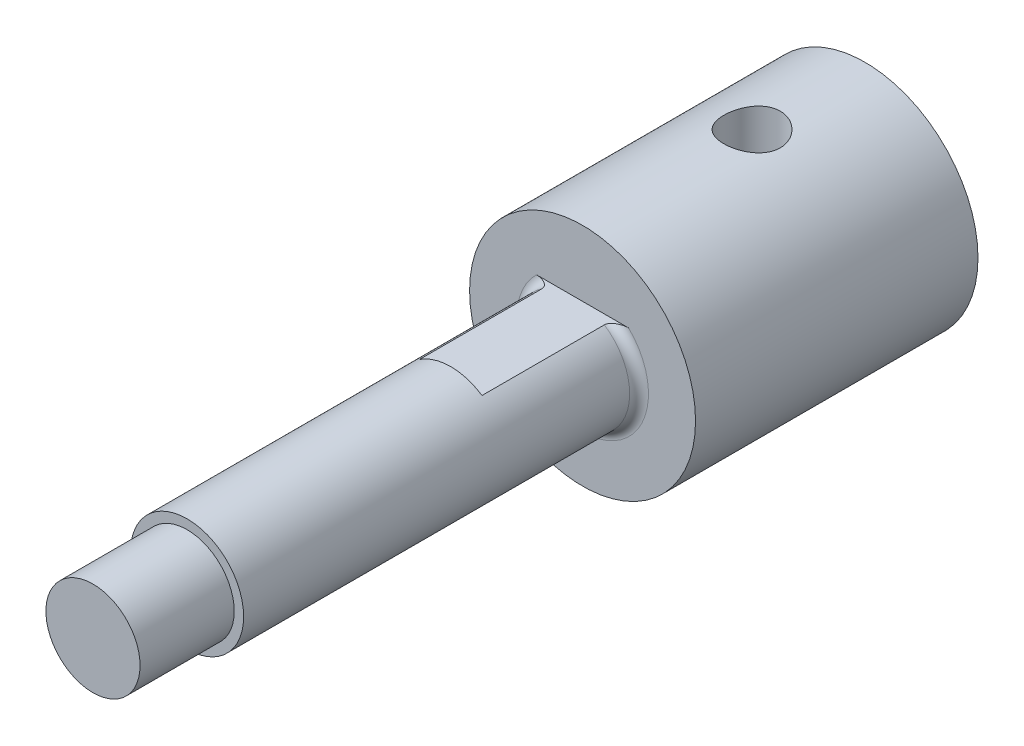
ISO-10303-21;
HEADER;
FILE_DESCRIPTION(('STEP AP214'),'2;1');
FILE_NAME('part.step','',(''),(''),'','','');
FILE_SCHEMA(('AUTOMOTIVE_DESIGN { 1 0 10303 214 1 1 1 1 }'));
ENDSEC;
DATA;
#1=APPLICATION_CONTEXT('core data for automotive mechanical design processes');
#2=APPLICATION_PROTOCOL_DEFINITION('international standard','automotive_design',2000,#1);
#3=PRODUCT_CONTEXT('',#1,'mechanical');
#4=PRODUCT('Part','Part','',(#3));
#5=PRODUCT_RELATED_PRODUCT_CATEGORY('part','',(#4));
#6=PRODUCT_DEFINITION_FORMATION('','',#4);
#7=PRODUCT_DEFINITION_CONTEXT('part definition',#1,'design');
#8=PRODUCT_DEFINITION('design','',#6,#7);
#9=PRODUCT_DEFINITION_SHAPE('','',#8);
#10=(LENGTH_UNIT() NAMED_UNIT(*) SI_UNIT(.MILLI.,.METRE.));
#11=(NAMED_UNIT(*) PLANE_ANGLE_UNIT() SI_UNIT($,.RADIAN.));
#12=(NAMED_UNIT(*) SI_UNIT($,.STERADIAN.) SOLID_ANGLE_UNIT());
#13=UNCERTAINTY_MEASURE_WITH_UNIT(LENGTH_MEASURE(1.E-05),#10,'distance_accuracy_value','');
#14=(GEOMETRIC_REPRESENTATION_CONTEXT(3) GLOBAL_UNCERTAINTY_ASSIGNED_CONTEXT((#13)) GLOBAL_UNIT_ASSIGNED_CONTEXT((#10,
#11,#12)) REPRESENTATION_CONTEXT('',''));
#15=CARTESIAN_POINT('',(0.,0.,0.));
#16=DIRECTION('',(0.,0.,1.));
#17=DIRECTION('',(1.,0.,0.));
#18=AXIS2_PLACEMENT_3D('',#15,#16,#17);
#19=CARTESIAN_POINT('',(6.91799850887597E-07,-0.0286323015875726,12.7411492059763));
#20=DIRECTION('',(0.,0.,-1.));
#21=DIRECTION('',(-1.,0.,0.));
#22=AXIS2_PLACEMENT_3D('',#19,#20,#21);
#23=CYLINDRICAL_SURFACE('',#22,3.);
#24=CARTESIAN_POINT('',(6.91799850887597E-07,-0.0286323015875726,7.24114920597634));
#25=DIRECTION('',(0.,0.,1.));
#26=DIRECTION('',(1.,0.,0.));
#27=AXIS2_PLACEMENT_3D('',#24,#25,#26);
#28=CIRCLE('',#27,3.);
#29=CARTESIAN_POINT('',(3.00000069179985,-0.0286323015875726,7.24114920597634));
#30=VERTEX_POINT('',#29);
#31=EDGE_CURVE('E138',#30,#30,#28,.T.);
#32=ORIENTED_EDGE('',*,*,#31,.T.);
#33=EDGE_LOOP('',(#32));
#34=FACE_BOUND('',#33,.T.);
#35=CARTESIAN_POINT('',(6.91799850887597E-07,2.97136769841243,9.49114920597634));
#36=CARTESIAN_POINT('',(-0.0414373525350146,2.97136699775249,9.49115036884542));
#37=CARTESIAN_POINT('',(-0.0828883871155306,2.97050058907157,9.49459498136323));
#38=CARTESIAN_POINT('',(-0.164602470085415,2.96712826756189,9.50826178162984));
#39=CARTESIAN_POINT('',(-0.204864831635518,2.96462142551227,9.51848781074526));
#40=CARTESIAN_POINT('',(-0.283009744291438,2.95824583007263,9.54536883270738));
#41=CARTESIAN_POINT('',(-0.320895089915151,2.95437871262286,9.56201610533398));
#42=CARTESIAN_POINT('',(-0.393335374152363,2.94569441745039,9.60123990099875));
#43=CARTESIAN_POINT('',(-0.427890200374529,2.94087720768268,9.62381662403581));
#44=CARTESIAN_POINT('',(-0.493400271850609,2.93070476637143,9.67474960080344));
#45=CARTESIAN_POINT('',(-0.524277153230685,2.92534123415509,9.70320499345593));
#46=CARTESIAN_POINT('',(-0.580873771801801,2.91473579900008,9.7648753084308));
#47=CARTESIAN_POINT('',(-0.606592926674717,2.90949390985417,9.79809076744958));
#48=CARTESIAN_POINT('',(-0.652512579599665,2.89964157691098,9.86894681934506));
#49=CARTESIAN_POINT('',(-0.672625416162828,2.89504167076545,9.90664582138154));
#50=CARTESIAN_POINT('',(-0.706197762475413,2.88711517247354,9.98502341180552));
#51=CARTESIAN_POINT('',(-0.719658335919816,2.88378837677637,10.0257015226392));
#52=CARTESIAN_POINT('',(-0.739276726602294,2.87887008200018,10.1080209550776));
#53=CARTESIAN_POINT('',(-0.745575442366819,2.87724515378956,10.1496266540012));
#54=CARTESIAN_POINT('',(-0.751130195734075,2.87581451110113,10.2333334904833));
#55=CARTESIAN_POINT('',(-0.750387379109138,2.87600850065565,10.2754345463256));
#56=CARTESIAN_POINT('',(-0.741992570519789,2.87816372589552,10.3578571098486));
#57=CARTESIAN_POINT('',(-0.734508478295409,2.88008201342182,10.3981970167089));
#58=CARTESIAN_POINT('',(-0.713111401651702,2.88540124679485,10.477029731432));
#59=CARTESIAN_POINT('',(-0.699197959234861,2.88880229826591,10.5155224074908));
#60=CARTESIAN_POINT('',(-0.665194047168726,2.89674326793336,10.5900182141024));
#61=CARTESIAN_POINT('',(-0.645042641816604,2.90129433575953,10.6259922918711));
#62=CARTESIAN_POINT('',(-0.599177446207626,2.91101625264436,10.6941085608548));
#63=CARTESIAN_POINT('',(-0.573462682604569,2.9161872100861,10.72625008001));
#64=CARTESIAN_POINT('',(-0.516331020540758,2.92674710111133,10.7867510138235));
#65=CARTESIAN_POINT('',(-0.484772437283079,2.93213804580229,10.814976451007));
#66=CARTESIAN_POINT('',(-0.417305266951999,2.94239752630636,10.8657598272083));
#67=CARTESIAN_POINT('',(-0.381396547054121,2.94726604615951,10.8883175931081));
#68=CARTESIAN_POINT('',(-0.306057252540845,2.95595635888334,10.9271744990885));
#69=CARTESIAN_POINT('',(-0.266615004804461,2.95977449905105,10.9434518761036));
#70=CARTESIAN_POINT('',(-0.18543731227159,2.96590728336952,10.9691078588311));
#71=CARTESIAN_POINT('',(-0.143702307775391,2.96822221510883,10.9784877841854));
#72=CARTESIAN_POINT('',(-0.0602692933951623,2.9710451947693,10.9898779887558));
#73=CARTESIAN_POINT('',(-0.0185976681942537,2.97159796595382,10.992070719014));
#74=CARTESIAN_POINT('',(0.0645171292006052,2.97096172248468,10.9895247049486));
#75=CARTESIAN_POINT('',(0.105960321622149,2.96977286462166,10.9847865845768));
#76=CARTESIAN_POINT('',(0.186807826188097,2.96581560404921,10.9686637517806));
#77=CARTESIAN_POINT('',(0.226233251284228,2.96307086934148,10.9573785742378));
#78=CARTESIAN_POINT('',(0.302629338026107,2.9563112315831,10.9285956639621));
#79=CARTESIAN_POINT('',(0.339599751316168,2.95229620026189,10.9110973038198));
#80=CARTESIAN_POINT('',(0.410762259014775,2.94333423804398,10.870031141539));
#81=CARTESIAN_POINT('',(0.444893412717767,2.93837203524709,10.846361149778));
#82=CARTESIAN_POINT('',(0.508763998621474,2.92809024434952,10.7937542515779));
#83=CARTESIAN_POINT('',(0.538502671286355,2.92277059467095,10.7648164361679));
#84=CARTESIAN_POINT('',(0.593495975836216,2.91221248321628,10.7016482255541));
#85=CARTESIAN_POINT('',(0.618622625610866,2.90697921934883,10.6673053544751));
#86=CARTESIAN_POINT('',(0.662756071306199,2.89733209029862,10.5947828887435));
#87=CARTESIAN_POINT('',(0.681763138878819,2.89291818874756,10.5566034644965));
#88=CARTESIAN_POINT('',(0.712976402104497,2.88545817208575,10.4776963447698));
#89=CARTESIAN_POINT('',(0.725222890126884,2.88240397487196,10.4369853918043));
#90=CARTESIAN_POINT('',(0.74267352177674,2.87800141886335,10.3539943870318));
#91=CARTESIAN_POINT('',(0.74787920553918,2.87665268701211,10.3117146804601));
#92=CARTESIAN_POINT('',(0.751019986966848,2.87584220443221,10.2280886940487));
#93=CARTESIAN_POINT('',(0.74915964068991,2.87632736205375,10.186750488414));
#94=CARTESIAN_POINT('',(0.738689330956284,2.87900724345164,10.1049972616423));
#95=CARTESIAN_POINT('',(0.730079503143235,2.88120193287171,10.0645822219695));
#96=CARTESIAN_POINT('',(0.706466351521248,2.88702400182604,9.98604497644363));
#97=CARTESIAN_POINT('',(0.691501394140039,2.89064277459397,9.94791055335624));
#98=CARTESIAN_POINT('',(0.655633148602386,2.89890647703657,9.87466651461949));
#99=CARTESIAN_POINT('',(0.634729036816945,2.90355154901629,9.83955731938288));
#100=CARTESIAN_POINT('',(0.586934566118419,2.91349586972999,9.77237189147533));
#101=CARTESIAN_POINT('',(0.559902273255978,2.91880902257121,9.74039866926436));
#102=CARTESIAN_POINT('',(0.500895377394719,2.92940783464386,9.68137568357863));
#103=CARTESIAN_POINT('',(0.468919602430424,2.93469348704773,9.65432709091985));
#104=CARTESIAN_POINT('',(0.400234485151146,2.94475597665074,9.60544355169403));
#105=CARTESIAN_POINT('',(0.363449902958044,2.94952186524177,9.58371189914055));
#106=CARTESIAN_POINT('',(0.286633721555089,2.95789232328802,9.54677547450607));
#107=CARTESIAN_POINT('',(0.24660447351822,2.96149772441133,9.53156602565207));
#108=CARTESIAN_POINT('',(0.172205818421587,2.96660799624014,9.51036329081151));
#109=CARTESIAN_POINT('',(0.138190777253885,2.96838062367588,9.50317358444962));
#110=CARTESIAN_POINT('',(0.0694537275679925,2.97076072457217,9.49356623416537));
#111=CARTESIAN_POINT('',(0.034731772421159,2.9713682856669,9.49114823132369));
#112=CARTESIAN_POINT('',(6.91799850887597E-07,2.97136769841243,9.49114920597634));
#113=B_SPLINE_CURVE_WITH_KNOTS('',3,(#35,#36,#37,#38,#39,#40,#41,#42,#43,#44,#45,#46,#47,#48,
#49,#50,#51,#52,#53,#54,#55,#56,#57,#58,#59,#60,#61,#62,#63,#64,#65,#66,#67,#68,#69,#70,#71,#72,
#73,#74,#75,#76,#77,#78,#79,#80,#81,#82,#83,#84,#85,#86,#87,#88,#89,#90,#91,#92,#93,#94,#95,#96,
#97,#98,#99,#100,#101,#102,#103,#104,#105,#106,#107,#108,#109,#110,#111,#112),.UNSPECIFIED.,.T.,
.F.,(4,2,2,2,2,2,2,2,2,2,2,2,2,2,2,2,2,2,2,2,2,2,2,2,2,2,2,2,2,2,2,2,2,2,2,2,2,2,4),(0.,
0.124186856235945,0.24844411888195,0.372552451143053,0.496664970084664,0.623072177185695,
0.749493647900309,0.877793237729035,1.00607230584684,1.13178147549715,1.25747019056349,
1.38011248503509,1.50276351733019,1.6266526393694,1.75056345418081,1.8780075048451,
2.00545544779124,2.13334114504557,2.26120236844321,2.38579154474638,2.51036950556371,
2.63310137257019,2.75584563661145,2.88076793782676,3.0057118150401,3.13372254602238,
3.26172759374754,3.38896127307018,3.51616711626204,3.63971890199306,3.76326820478017,
3.88608200279724,4.00891284068451,4.13494788204955,4.26101284885209,4.38936092749794,
4.51761681910675,4.62171121471074,4.7257977802152),.UNSPECIFIED.);
#114=CARTESIAN_POINT('',(6.91799850887597E-07,2.97136769841243,9.49114920597634));
#115=VERTEX_POINT('',#114);
#116=EDGE_CURVE('E107',#115,#115,#113,.T.);
#117=ORIENTED_EDGE('',*,*,#116,.F.);
#118=EDGE_LOOP('',(#117));
#119=FACE_BOUND('',#118,.T.);
#120=CARTESIAN_POINT('',(6.91799850887597E-07,-0.0286323015875726,14.7411492059763));
#121=DIRECTION('',(0.,0.,1.));
#122=DIRECTION('',(1.,0.,0.));
#123=AXIS2_PLACEMENT_3D('',#120,#121,#122);
#124=CIRCLE('',#123,3.);
#125=CARTESIAN_POINT('',(3.00000069179985,-0.0286323015875726,14.7411492059763));
#126=VERTEX_POINT('',#125);
#127=EDGE_CURVE('E103',#126,#126,#124,.T.);
#128=ORIENTED_EDGE('',*,*,#127,.F.);
#129=EDGE_LOOP('',(#128));
#130=FACE_BOUND('',#129,.T.);
#131=ADVANCED_FACE('F37',(#34,#119,#130),#23,.T.);
#132=CARTESIAN_POINT('',(6.91799850887597E-07,-0.0286323015875726,12.7411492059763));
#133=DIRECTION('',(0.,0.,-1.));
#134=DIRECTION('',(-1.,0.,0.));
#135=AXIS2_PLACEMENT_3D('',#132,#133,#134);
#136=CYLINDRICAL_SURFACE('',#135,1.5);
#137=CARTESIAN_POINT('',(6.91799850887597E-07,-0.0286323015875726,7.24114920597634));
#138=DIRECTION('',(0.,0.,1.));
#139=DIRECTION('',(1.,0.,0.));
#140=AXIS2_PLACEMENT_3D('',#137,#138,#139);
#141=CIRCLE('',#140,1.5);
#142=CARTESIAN_POINT('',(1.50000069179985,-0.0286323015875726,7.24114920597634));
#143=VERTEX_POINT('',#142);
#144=EDGE_CURVE('E114',#143,#143,#141,.T.);
#145=ORIENTED_EDGE('',*,*,#144,.F.);
#146=EDGE_LOOP('',(#145));
#147=FACE_BOUND('',#146,.T.);
#148=CARTESIAN_POINT('',(6.91799850887597E-07,-0.0286323015875726,12.7411492059763));
#149=DIRECTION('',(0.,0.,1.));
#150=DIRECTION('',(1.,0.,0.));
#151=AXIS2_PLACEMENT_3D('',#148,#149,#150);
#152=CIRCLE('',#151,1.5);
#153=CARTESIAN_POINT('',(1.50000069179985,-0.0286323015875726,12.7411492059763));
#154=VERTEX_POINT('',#153);
#155=EDGE_CURVE('E106',#154,#154,#152,.T.);
#156=ORIENTED_EDGE('',*,*,#155,.T.);
#157=EDGE_LOOP('',(#156));
#158=FACE_BOUND('',#157,.T.);
#159=CARTESIAN_POINT('',(6.91799850887597E-07,1.47136769841243,9.49114920597634));
#160=CARTESIAN_POINT('',(-0.0394282804148889,1.47136554894356,9.49115168271596));
#161=CARTESIAN_POINT('',(-0.0789042579736734,1.46979638105881,9.49427676081759));
#162=CARTESIAN_POINT('',(-0.156689484651468,1.4636738686929,9.50663886623203));
#163=CARTESIAN_POINT('',(-0.194996373235277,1.4591148571298,9.51588750072458));
#164=CARTESIAN_POINT('',(-0.26919946686058,1.44748979393726,9.54004456243893));
#165=CARTESIAN_POINT('',(-0.305104410404534,1.44043349224383,9.55493099416235));
#166=CARTESIAN_POINT('',(-0.373853770805073,1.42446102228077,9.58982717200004));
#167=CARTESIAN_POINT('',(-0.406698428692686,1.4155450006639,9.60983651416298));
#168=CARTESIAN_POINT('',(-0.470630171521588,1.39603963534785,9.65578714309031));
#169=CARTESIAN_POINT('',(-0.501490716541733,1.38538169186895,9.68201406540607));
#170=CARTESIAN_POINT('',(-0.558583891850382,1.36381747526301,9.73904031541161));
#171=CARTESIAN_POINT('',(-0.584812995530224,1.35291101998019,9.76984309480567));
#172=CARTESIAN_POINT('',(-0.633938308537858,1.33110983239253,9.83801171811888));
#173=CARTESIAN_POINT('',(-0.656418309863877,1.32028160068842,9.87570127973577));
#174=CARTESIAN_POINT('',(-0.694625478368171,1.30101253920483,9.954924707966));
#175=CARTESIAN_POINT('',(-0.710357469424899,1.29257000546485,9.9964558025184));
#176=CARTESIAN_POINT('',(-0.733598639841591,1.27980170119599,10.0796480350428));
#177=CARTESIAN_POINT('',(-0.74154370101048,1.27525973529028,10.1211525450269));
#178=CARTESIAN_POINT('',(-0.750319553181784,1.27023187302639,10.2051333343109));
#179=CARTESIAN_POINT('',(-0.751157374479955,1.26974196848709,10.2476086116297));
#180=CARTESIAN_POINT('',(-0.74601477357937,1.27269967534179,10.3268637242129));
#181=CARTESIAN_POINT('',(-0.740837727852765,1.27568342587753,10.3637172293936));
#182=CARTESIAN_POINT('',(-0.725204194992849,1.2844394139163,10.4359406380061));
#183=CARTESIAN_POINT('',(-0.714746026123389,1.29021253965075,10.4713100649553));
#184=CARTESIAN_POINT('',(-0.688656643489652,1.30402377150799,10.5405710554006));
#185=CARTESIAN_POINT('',(-0.672910608537145,1.31211150339242,10.5744090050657));
#186=CARTESIAN_POINT('',(-0.636780573951151,1.32964323052296,10.6391249254188));
#187=CARTESIAN_POINT('',(-0.6163944910595,1.33908783426386,10.6700015576764));
#188=CARTESIAN_POINT('',(-0.568548849384741,1.35971638268707,10.7320401455338));
#189=CARTESIAN_POINT('',(-0.54052015197711,1.37096902518802,10.7627418611585));
#190=CARTESIAN_POINT('',(-0.479665992256179,1.39297487316548,10.8192007699195));
#191=CARTESIAN_POINT('',(-0.446838250630863,1.40372783810343,10.8449556000018));
#192=CARTESIAN_POINT('',(-0.375386687574035,1.42413260303466,10.8919134517486));
#193=CARTESIAN_POINT('',(-0.336564501899705,1.43371007962748,10.9128495603106));
#194=CARTESIAN_POINT('',(-0.255348969816746,1.45005180682174,10.9477219777586));
#195=CARTESIAN_POINT('',(-0.212958490399106,1.45681829048907,10.9616638447377));
#196=CARTESIAN_POINT('',(-0.129574176945675,1.4663002014732,10.9810057587638));
#197=CARTESIAN_POINT('',(-0.0887554561113922,1.46930473567227,10.9870176327864));
#198=CARTESIAN_POINT('',(-0.00658400816216417,1.47191529935569,10.9922477543272));
#199=CARTESIAN_POINT('',(0.0347684567022771,1.47152293882227,10.9914692202059));
#200=CARTESIAN_POINT('',(0.113425420789346,1.46755164031323,10.9834941896623));
#201=CARTESIAN_POINT('',(0.150795247837317,1.46422204107385,10.9767998064288));
#202=CARTESIAN_POINT('',(0.223805861026288,1.45503398327357,10.957970652055));
#203=CARTESIAN_POINT('',(0.259446456068098,1.44917524591992,10.9458352811363));
#204=CARTESIAN_POINT('',(0.3291671481371,1.43524958401495,10.9161503561515));
#205=CARTESIAN_POINT('',(0.363173489554467,1.42712431168697,10.8984559183887));
#206=CARTESIAN_POINT('',(0.427846713074043,1.40944750579074,10.8583185542418));
#207=CARTESIAN_POINT('',(0.458512164131313,1.39989536515582,10.8358736050313));
#208=CARTESIAN_POINT('',(0.51882645876784,1.37917935844341,10.7843288869767));
#209=CARTESIAN_POINT('',(0.548079750168329,1.36794933477574,10.7547920546362));
#210=CARTESIAN_POINT('',(0.60139293263478,1.34583563544149,10.6912053425244));
#211=CARTESIAN_POINT('',(0.625449231067981,1.33495220377388,10.6571523668641));
#212=CARTESIAN_POINT('',(0.668781627673122,1.31425164010794,10.5834164653261));
#213=CARTESIAN_POINT('',(0.687769813708828,1.30451167088847,10.5435407563199));
#214=CARTESIAN_POINT('',(0.718562811310202,1.28817324117337,10.460516655207));
#215=CARTESIAN_POINT('',(0.730376878715528,1.28157073521706,10.4173725611004));
#216=CARTESIAN_POINT('',(0.74539695738711,1.27307895597743,10.3334665388303));
#217=CARTESIAN_POINT('',(0.7493204391005,1.27079807436611,10.2928735159046));
#218=CARTESIAN_POINT('',(0.750517557585441,1.27010785825874,10.2115639055983));
#219=CARTESIAN_POINT('',(0.74779407676815,1.27169684561907,10.1708473794218));
#220=CARTESIAN_POINT('',(0.736445285994048,1.27815166378761,10.0945365798273));
#221=CARTESIAN_POINT('',(0.728406927556951,1.28269090703038,10.058823853368));
#222=CARTESIAN_POINT('',(0.707382210468335,1.29415031982181,9.98929311640781));
#223=CARTESIAN_POINT('',(0.694394260169709,1.30107125518499,9.95547571940736));
#224=CARTESIAN_POINT('',(0.662862500775363,1.31708167614639,9.88818056773638));
#225=CARTESIAN_POINT('',(0.644004045162194,1.32628561638386,9.85487827960406));
#226=CARTESIAN_POINT('',(0.601613920527326,1.34563268567185,9.7916933038409));
#227=CARTESIAN_POINT('',(0.578079820228837,1.35577630187134,9.76181240808747));
#228=CARTESIAN_POINT('',(0.523653186798332,1.37733512210727,9.70254271920813));
#229=CARTESIAN_POINT('',(0.49221400905748,1.38875507324844,9.6736548792049));
#230=CARTESIAN_POINT('',(0.424616796465061,1.41045084032558,9.62145196840861));
#231=CARTESIAN_POINT('',(0.38845623424244,1.42072603797273,9.59813990140662));
#232=CARTESIAN_POINT('',(0.311949389414811,1.4391027703007,9.55772193390469));
#233=CARTESIAN_POINT('',(0.271575319750812,1.44718842263424,9.54066107891776));
#234=CARTESIAN_POINT('',(0.188057267770494,1.46012775863842,9.51379308003712));
#235=CARTESIAN_POINT('',(0.144921541517225,1.46499062370942,9.50396532085415));
#236=CARTESIAN_POINT('',(0.0844521516623888,1.4690836627349,9.49572614766945));
#237=CARTESIAN_POINT('',(0.067622101379475,1.46993793845644,9.49401222532862));
#238=CARTESIAN_POINT('',(0.0338644906552192,1.47108042574641,9.49172320683873));
#239=CARTESIAN_POINT('',(0.016936927535387,1.47136862169065,9.49114814212294));
#240=CARTESIAN_POINT('',(6.91799850887597E-07,1.47136769841243,9.49114920597634));
#241=B_SPLINE_CURVE_WITH_KNOTS('',3,(#159,#160,#161,#162,#163,#164,#165,#166,#167,#168,#169,
#170,#171,#172,#173,#174,#175,#176,#177,#178,#179,#180,#181,#182,#183,#184,#185,#186,#187,#188,
#189,#190,#191,#192,#193,#194,#195,#196,#197,#198,#199,#200,#201,#202,#203,#204,#205,#206,#207,
#208,#209,#210,#211,#212,#213,#214,#215,#216,#217,#218,#219,#220,#221,#222,#223,#224,#225,#226,
#227,#228,#229,#230,#231,#232,#233,#234,#235,#236,#237,#238,#239,#240),.UNSPECIFIED.,.T.,.F.,(4,
2,2,2,2,2,2,2,2,2,2,2,2,2,2,2,2,2,2,2,2,2,2,2,2,2,2,2,2,2,2,2,2,2,2,2,2,2,2,2,4),(0.,
0.118218193065219,0.236661112281898,0.354646616619224,0.472622820436176,0.597736319038567,
0.722944678240527,0.857862948230645,0.992684609237108,1.11943509105172,1.24606017996765,
1.3575428430699,1.46906102944259,1.58317680126365,1.69734390945166,1.82598706000409,
1.95469150949015,2.0893726666083,2.2239466268421,2.34737467853509,2.47074423383607,
2.58455179879591,2.69837191223199,2.81544642020924,2.93257088061254,3.06119707983314,
3.18991191461574,3.32486011619755,3.45963383955583,3.5814698062378,3.70325294895004,
3.81343447683137,3.92365146587758,4.04127342581711,4.15895670854218,4.29093932064374,
4.4229928753243,4.55598010247194,4.68858681468698,4.73936460103273,4.79014378886135),.UNSPECIFIED.);
#242=CARTESIAN_POINT('',(6.91799850887597E-07,1.47136769841243,9.49114920597634));
#243=VERTEX_POINT('',#242);
#244=EDGE_CURVE('E115',#243,#243,#241,.T.);
#245=ORIENTED_EDGE('',*,*,#244,.T.);
#246=EDGE_LOOP('',(#245));
#247=FACE_BOUND('',#246,.T.);
#248=ADVANCED_FACE('F128',(#147,#158,#247),#136,.F.);
#249=CARTESIAN_POINT('',(6.91799850887597E-07,-0.0286323015875726,7.24114920597634));
#250=DIRECTION('',(0.,0.,1.));
#251=DIRECTION('',(1.,0.,0.));
#252=AXIS2_PLACEMENT_3D('',#249,#250,#251);
#253=PLANE('',#252);
#254=ORIENTED_EDGE('',*,*,#31,.F.);
#255=EDGE_LOOP('',(#254));
#256=FACE_BOUND('',#255,.T.);
#257=ORIENTED_EDGE('',*,*,#144,.T.);
#258=EDGE_LOOP('',(#257));
#259=FACE_BOUND('',#258,.T.);
#260=ADVANCED_FACE('F125',(#256,#259),#253,.F.);
#261=CARTESIAN_POINT('',(6.91799850887597E-07,2.97136769841243,10.2411492059763));
#262=DIRECTION('',(0.,-1.,0.));
#263=DIRECTION('',(0.,0.,-1.));
#264=AXIS2_PLACEMENT_3D('',#261,#262,#263);
#265=CYLINDRICAL_SURFACE('',#264,0.75);
#266=ORIENTED_EDGE('',*,*,#244,.F.);
#267=EDGE_LOOP('',(#266));
#268=FACE_BOUND('',#267,.T.);
#269=ORIENTED_EDGE('',*,*,#116,.T.);
#270=EDGE_LOOP('',(#269));
#271=FACE_BOUND('',#270,.T.);
#272=ADVANCED_FACE('F119',(#268,#271),#265,.F.);
#273=CARTESIAN_POINT('',(6.91799850887597E-07,-0.0286323015875726,12.7411492059763));
#274=DIRECTION('',(0.,0.,1.));
#275=DIRECTION('',(1.,0.,0.));
#276=AXIS2_PLACEMENT_3D('',#273,#274,#275);
#277=PLANE('',#276);
#278=ORIENTED_EDGE('',*,*,#155,.F.);
#279=EDGE_LOOP('',(#278));
#280=FACE_BOUND('',#279,.T.);
#281=ADVANCED_FACE('F124',(#280),#277,.F.);
#282=CARTESIAN_POINT('',(6.91799850887597E-07,-0.0286323015875726,14.7411492059763));
#283=DIRECTION('',(0.,0.,1.));
#284=DIRECTION('',(1.,0.,0.));
#285=AXIS2_PLACEMENT_3D('',#282,#283,#284);
#286=PLANE('',#285);
#287=DIRECTION('',(-1.,0.,0.));
#288=VECTOR('',#287,1.);
#289=CARTESIAN_POINT('',(-0.829155505788999,1.22136769841243,14.7411492059763));
#290=LINE('',#289,#288);
#291=CARTESIAN_POINT('',(1.22474556319144,1.22136769841243,14.7411492059763));
#292=VERTEX_POINT('',#291);
#293=CARTESIAN_POINT('',(-1.22474417959174,1.22136769841243,14.7411492059763));
#294=VERTEX_POINT('',#293);
#295=EDGE_CURVE('E57',#292,#294,#290,.T.);
#296=ORIENTED_EDGE('',*,*,#295,.F.);
#297=CARTESIAN_POINT('',(6.91799850887597E-07,-0.0286323015875726,14.7411492059763));
#298=DIRECTION('',(0.,0.,1.));
#299=DIRECTION('',(1.,0.,0.));
#300=AXIS2_PLACEMENT_3D('',#297,#298,#299);
#301=CIRCLE('',#300,1.75);
#302=EDGE_CURVE('E141',#292,#294,#301,.F.);
#303=ORIENTED_EDGE('',*,*,#302,.T.);
#304=EDGE_LOOP('',(#296,#303));
#305=FACE_BOUND('',#304,.T.);
#306=ORIENTED_EDGE('',*,*,#127,.T.);
#307=EDGE_LOOP('',(#306));
#308=FACE_BOUND('',#307,.T.);
#309=ADVANCED_FACE('F154',(#305,#308),#286,.T.);
#310=CARTESIAN_POINT('',(6.91799850887597E-07,-0.0286323015875726,18.2411492059763));
#311=DIRECTION('',(0.,0.,-1.));
#312=DIRECTION('',(-1.,0.,0.));
#313=AXIS2_PLACEMENT_3D('',#310,#311,#312);
#314=CYLINDRICAL_SURFACE('',#313,1.5);
#315=DIRECTION('',(0.,0.,-1.));
#316=VECTOR('',#315,1.);
#317=CARTESIAN_POINT('',(-0.829155505788999,1.22136769841243,18.2411492059763));
#318=LINE('',#317,#316);
#319=CARTESIAN_POINT('',(-0.829155505789,1.22136769841243,18.2411492059763));
#320=VERTEX_POINT('',#319);
#321=CARTESIAN_POINT('',(-0.829155505788999,1.22136769841243,14.9911492059763));
#322=VERTEX_POINT('',#321);
#323=EDGE_CURVE('E72',#320,#322,#318,.T.);
#324=ORIENTED_EDGE('',*,*,#323,.T.);
#325=CARTESIAN_POINT('',(6.91799850887597E-07,-0.0286323015875726,14.9911492059763));
#326=DIRECTION('',(0.,0.,1.));
#327=DIRECTION('',(1.,0.,0.));
#328=AXIS2_PLACEMENT_3D('',#325,#326,#327);
#329=CIRCLE('',#328,1.5);
#330=CARTESIAN_POINT('',(0.829156889388701,1.22136769841243,14.9911492059763));
#331=VERTEX_POINT('',#330);
#332=EDGE_CURVE('E139',#322,#331,#329,.T.);
#333=ORIENTED_EDGE('',*,*,#332,.T.);
#334=DIRECTION('',(0.,0.,-1.));
#335=VECTOR('',#334,1.);
#336=CARTESIAN_POINT('',(0.829156889388701,1.22136769841243,18.2411492059763));
#337=LINE('',#336,#335);
#338=CARTESIAN_POINT('',(0.829156889388701,1.22136769841243,18.2411492059763));
#339=VERTEX_POINT('',#338);
#340=EDGE_CURVE('E83',#339,#331,#337,.T.);
#341=ORIENTED_EDGE('',*,*,#340,.F.);
#342=CARTESIAN_POINT('',(6.91799850887597E-07,-0.0286323015875726,18.2411492059763));
#343=DIRECTION('',(0.,0.,1.));
#344=DIRECTION('',(1.,0.,0.));
#345=AXIS2_PLACEMENT_3D('',#342,#343,#344);
#346=CIRCLE('',#345,1.5);
#347=EDGE_CURVE('E88',#339,#320,#346,.T.);
#348=ORIENTED_EDGE('',*,*,#347,.T.);
#349=EDGE_LOOP('',(#324,#333,#341,#348));
#350=FACE_BOUND('',#349,.T.);
#351=CARTESIAN_POINT('',(6.91799850887597E-07,-0.0286323015875726,25.2411492059763));
#352=DIRECTION('',(0.,0.,1.));
#353=DIRECTION('',(1.,0.,0.));
#354=AXIS2_PLACEMENT_3D('',#351,#352,#353);
#355=CIRCLE('',#354,1.5);
#356=CARTESIAN_POINT('',(1.50000069179985,-0.0286323015875726,25.2411492059763));
#357=VERTEX_POINT('',#356);
#358=EDGE_CURVE('E92',#357,#357,#355,.T.);
#359=ORIENTED_EDGE('',*,*,#358,.F.);
#360=EDGE_LOOP('',(#359));
#361=FACE_BOUND('',#360,.T.);
#362=ADVANCED_FACE('F90',(#350,#361),#314,.T.);
#363=CARTESIAN_POINT('',(-0.829155505788999,1.22136769841243,18.2411492059763));
#364=DIRECTION('',(0.,-1.,0.));
#365=DIRECTION('',(0.,0.,-1.));
#366=AXIS2_PLACEMENT_3D('',#363,#364,#365);
#367=PLANE('',#366);
#368=ORIENTED_EDGE('',*,*,#295,.T.);
#369=CARTESIAN_POINT('',(-1.22474417959174,1.22136769841243,14.7411492059763));
#370=CARTESIAN_POINT('',(-1.20969800614567,1.22136769841243,14.7411529900924));
#371=CARTESIAN_POINT('',(-1.19466537497488,1.22136769841243,14.7418140470758));
#372=CARTESIAN_POINT('',(-1.16470518370032,1.22136769841243,14.744401785415));
#373=CARTESIAN_POINT('',(-1.14977764988422,1.22136769841243,14.7463287727891));
#374=CARTESIAN_POINT('',(-1.10501735255556,1.22136769841243,14.7539797244207));
#375=CARTESIAN_POINT('',(-1.07547700016086,1.22136769841243,14.7615720589956));
#376=CARTESIAN_POINT('',(-1.02470317791437,1.22136769841243,14.7793253081169));
#377=CARTESIAN_POINT('',(-1.00311645676078,1.22136769841243,14.7884999849544));
#378=CARTESIAN_POINT('',(-0.96156421430418,1.22136769841243,14.8099288276974));
#379=CARTESIAN_POINT('',(-0.941592706282843,1.22136769841243,14.8221708605897));
#380=CARTESIAN_POINT('',(-0.912535945441705,1.22136769841243,14.8440278011034));
#381=CARTESIAN_POINT('',(-0.902531818900248,1.22136769841243,14.852422996358));
#382=CARTESIAN_POINT('',(-0.883696585033778,1.22136769841243,14.8704646992181));
#383=CARTESIAN_POINT('',(-0.874864924431815,1.22136769841243,14.8801106123419));
#384=CARTESIAN_POINT('',(-0.86073598673253,1.22136769841243,14.8984047278224));
#385=CARTESIAN_POINT('',(-0.855091534471518,1.22136769841243,14.9067820589118));
#386=CARTESIAN_POINT('',(-0.845208697227097,1.22136769841243,14.9243054354309));
#387=CARTESIAN_POINT('',(-0.840964546210546,1.22136769841243,14.933448129104));
#388=CARTESIAN_POINT('',(-0.834907385960766,1.22136769841243,14.9506092565965));
#389=CARTESIAN_POINT('',(-0.832788047237587,1.22136769841243,14.9585178901861));
#390=CARTESIAN_POINT('',(-0.829894955642934,1.22136769841243,14.9746571560293));
#391=CARTESIAN_POINT('',(-0.829135141510564,1.22136769841243,14.9828902490759));
#392=CARTESIAN_POINT('',(-0.829155505788973,1.22136769841243,14.9911492059763));
#393=B_SPLINE_CURVE_WITH_KNOTS('',3,(#369,#370,#371,#372,#373,#374,#375,#376,#377,#378,#379,
#380,#381,#382,#383,#384,#385,#386,#387,#388,#389,#390,#391,#392),.UNSPECIFIED.,.F.,.F.,(4,2,2,
2,2,2,2,2,2,2,2,4),(0.,0.0450996365959334,0.0902101793152455,0.181232105893071,
0.251411768604862,0.321318099033901,0.360417721778356,0.399498827649005,0.429704971250216,
0.45978513559716,0.484236039427718,0.508936223945825),.UNSPECIFIED.);
#394=EDGE_CURVE('E11',#294,#322,#393,.T.);
#395=ORIENTED_EDGE('',*,*,#394,.T.);
#396=ORIENTED_EDGE('',*,*,#323,.F.);
#397=DIRECTION('',(-1.,0.,0.));
#398=VECTOR('',#397,1.);
#399=CARTESIAN_POINT('',(-0.829155505788999,1.22136769841243,18.2411492059763));
#400=LINE('',#399,#398);
#401=EDGE_CURVE('E76',#339,#320,#400,.T.);
#402=ORIENTED_EDGE('',*,*,#401,.F.);
#403=ORIENTED_EDGE('',*,*,#340,.T.);
#404=CARTESIAN_POINT('',(0.829156889388701,1.22136769841243,14.9911492059763));
#405=CARTESIAN_POINT('',(0.829135486649642,1.22136769841243,14.9827598600102));
#406=CARTESIAN_POINT('',(0.829919842983571,1.22136769841243,14.9743984200507));
#407=CARTESIAN_POINT('',(0.832901520246231,1.22136769841243,14.958021812278));
#408=CARTESIAN_POINT('',(0.835083290180815,1.22136769841243,14.9500038570562));
#409=CARTESIAN_POINT('',(0.841363882522285,1.22136769841243,14.9324723634728));
#410=CARTESIAN_POINT('',(0.845804669286281,1.22136769841243,14.9230832162712));
#411=CARTESIAN_POINT('',(0.856144797070143,1.22136769841243,14.9051153706713));
#412=CARTESIAN_POINT('',(0.862050908496349,1.22136769841243,14.896540697225));
#413=CARTESIAN_POINT('',(0.878408841040261,1.22136769841243,14.8758354515338));
#414=CARTESIAN_POINT('',(0.889592358483018,1.22136769841243,14.864287447451));
#415=CARTESIAN_POINT('',(0.913551079252856,1.22136769841243,14.8430054087458));
#416=CARTESIAN_POINT('',(0.926329639761157,1.22136769841243,14.8332753115459));
#417=CARTESIAN_POINT('',(0.961200223170839,1.22136769841243,14.8098784175199));
#418=CARTESIAN_POINT('',(0.984159406398997,1.22136769841243,14.7975050246413));
#419=CARTESIAN_POINT('',(1.03169204048934,1.22136769841243,14.7764302036606));
#420=CARTESIAN_POINT('',(1.05626808257223,1.22136769841243,14.7677348443046));
#421=CARTESIAN_POINT('',(1.10472920877624,1.22136769841243,14.7543550966466));
#422=CARTESIAN_POINT('',(1.12855120177113,1.22136769841243,14.7494420355921));
#423=CARTESIAN_POINT('',(1.17649393864864,1.22136769841243,14.7428617616015));
#424=CARTESIAN_POINT('',(1.2006120833199,1.22136769841243,14.7411755288668));
#425=CARTESIAN_POINT('',(1.22474556319144,1.22136769841243,14.7411492059763));
#426=B_SPLINE_CURVE_WITH_KNOTS('',3,(#404,#405,#406,#407,#408,#409,#410,#411,#412,#413,#414,
#415,#416,#417,#418,#419,#420,#421,#422,#423,#424,#425),.UNSPECIFIED.,.F.,.F.,(4,2,2,2,2,2,2,2,
2,2,4),(0.,0.0250863122829336,0.0498981928183667,0.0808849527767992,0.112017641360161,
0.159974955200422,0.20803496570657,0.285856133837709,0.363805210501605,0.436559848912016,
0.508884314784031),.UNSPECIFIED.);
#427=EDGE_CURVE('E51',#331,#292,#426,.T.);
#428=ORIENTED_EDGE('',*,*,#427,.T.);
#429=EDGE_LOOP('',(#368,#395,#396,#402,#403,#428));
#430=FACE_BOUND('',#429,.T.);
#431=ADVANCED_FACE('F74',(#430),#367,.F.);
#432=CARTESIAN_POINT('',(6.91799850887597E-07,-0.0286323015875726,18.2411492059763));
#433=DIRECTION('',(0.,0.,1.));
#434=DIRECTION('',(1.,0.,0.));
#435=AXIS2_PLACEMENT_3D('',#432,#433,#434);
#436=PLANE('',#435);
#437=ORIENTED_EDGE('',*,*,#347,.F.);
#438=ORIENTED_EDGE('',*,*,#401,.T.);
#439=EDGE_LOOP('',(#437,#438));
#440=FACE_BOUND('',#439,.T.);
#441=ADVANCED_FACE('F87',(#440),#436,.F.);
#442=CARTESIAN_POINT('',(6.91799850887597E-07,-0.0286323015875726,25.2411492059763));
#443=DIRECTION('',(0.,0.,1.));
#444=DIRECTION('',(1.,0.,0.));
#445=AXIS2_PLACEMENT_3D('',#442,#443,#444);
#446=PLANE('',#445);
#447=CARTESIAN_POINT('',(6.91799850887597E-07,-0.0286323015875726,25.2411492059763));
#448=DIRECTION('',(0.,0.,1.));
#449=DIRECTION('',(1.,0.,0.));
#450=AXIS2_PLACEMENT_3D('',#447,#448,#449);
#451=CIRCLE('',#450,1.25);
#452=CARTESIAN_POINT('',(1.25000069179985,-0.0286323015875726,25.2411492059763));
#453=VERTEX_POINT('',#452);
#454=EDGE_CURVE('E142',#453,#453,#451,.T.);
#455=ORIENTED_EDGE('',*,*,#454,.F.);
#456=EDGE_LOOP('',(#455));
#457=FACE_BOUND('',#456,.T.);
#458=ORIENTED_EDGE('',*,*,#358,.T.);
#459=EDGE_LOOP('',(#458));
#460=FACE_BOUND('',#459,.T.);
#461=ADVANCED_FACE('F224',(#457,#460),#446,.T.);
#462=CARTESIAN_POINT('',(6.91799850887597E-07,-0.0286323015875726,27.7411492059763));
#463=DIRECTION('',(0.,0.,-1.));
#464=DIRECTION('',(-1.,0.,0.));
#465=AXIS2_PLACEMENT_3D('',#462,#463,#464);
#466=CYLINDRICAL_SURFACE('',#465,1.25);
#467=CARTESIAN_POINT('',(6.91799850887597E-07,-0.0286323015875726,27.7411492059763));
#468=DIRECTION('',(0.,0.,1.));
#469=DIRECTION('',(1.,0.,0.));
#470=AXIS2_PLACEMENT_3D('',#467,#468,#469);
#471=CIRCLE('',#470,1.25);
#472=CARTESIAN_POINT('',(1.25000069179985,-0.0286323015875726,27.7411492059763));
#473=VERTEX_POINT('',#472);
#474=EDGE_CURVE('E93',#473,#473,#471,.T.);
#475=ORIENTED_EDGE('',*,*,#474,.F.);
#476=EDGE_LOOP('',(#475));
#477=FACE_BOUND('',#476,.T.);
#478=ORIENTED_EDGE('',*,*,#454,.T.);
#479=EDGE_LOOP('',(#478));
#480=FACE_BOUND('',#479,.T.);
#481=ADVANCED_FACE('F232',(#477,#480),#466,.T.);
#482=CARTESIAN_POINT('',(6.91799850887597E-07,-0.0286323015875726,27.7411492059763));
#483=DIRECTION('',(0.,0.,1.));
#484=DIRECTION('',(1.,0.,0.));
#485=AXIS2_PLACEMENT_3D('',#482,#483,#484);
#486=PLANE('',#485);
#487=ORIENTED_EDGE('',*,*,#474,.T.);
#488=EDGE_LOOP('',(#487));
#489=FACE_BOUND('',#488,.T.);
#490=ADVANCED_FACE('F241',(#489),#486,.T.);
#491=CARTESIAN_POINT('',(6.91799850887597E-07,-0.0286323015875726,14.9911492059763));
#492=DIRECTION('',(0.,0.,1.));
#493=DIRECTION('',(1.,0.,0.));
#494=AXIS2_PLACEMENT_3D('',#491,#492,#493);
#495=TOROIDAL_SURFACE('',#494,1.75,0.25);
#496=ORIENTED_EDGE('',*,*,#394,.F.);
#497=ORIENTED_EDGE('',*,*,#302,.F.);
#498=ORIENTED_EDGE('',*,*,#427,.F.);
#499=ORIENTED_EDGE('',*,*,#332,.F.);
#500=EDGE_LOOP('',(#496,#497,#498,#499));
#501=FACE_BOUND('',#500,.T.);
#502=ADVANCED_FACE('F39',(#501),#495,.F.);
#503=CLOSED_SHELL('',(#131,#248,#260,#272,#281,#309,#362,#431,#441,#461,#481,#490,#502));
#504=MANIFOLD_SOLID_BREP('B2',#503);
#505=ADVANCED_BREP_SHAPE_REPRESENTATION('',(#18,#504),#14);
#506=SHAPE_DEFINITION_REPRESENTATION(#9,#505);
ENDSEC;
END-ISO-10303-21;
